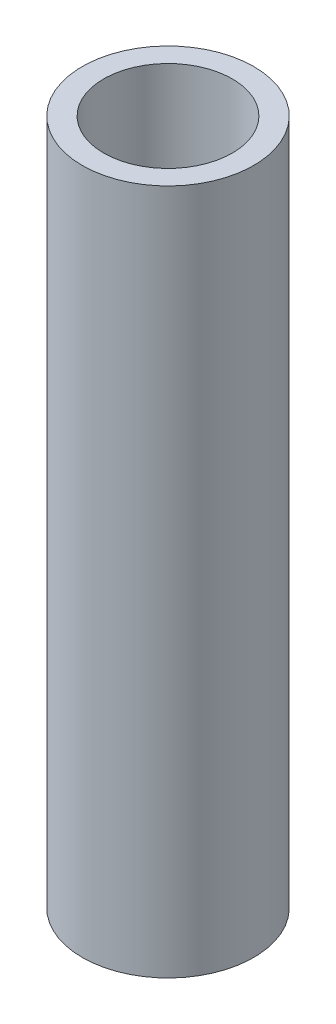
ISO-10303-21;
HEADER;
FILE_DESCRIPTION(('STEP AP214'),'2;1');
FILE_NAME('part.step','',(''),(''),'','','');
FILE_SCHEMA(('AUTOMOTIVE_DESIGN { 1 0 10303 214 1 1 1 1 }'));
ENDSEC;
DATA;
#1=APPLICATION_CONTEXT('core data for automotive mechanical design processes');
#2=APPLICATION_PROTOCOL_DEFINITION('international standard','automotive_design',2000,#1);
#3=PRODUCT_CONTEXT('',#1,'mechanical');
#4=PRODUCT('Part','Part','',(#3));
#5=PRODUCT_RELATED_PRODUCT_CATEGORY('part','',(#4));
#6=PRODUCT_DEFINITION_FORMATION('','',#4);
#7=PRODUCT_DEFINITION_CONTEXT('part definition',#1,'design');
#8=PRODUCT_DEFINITION('design','',#6,#7);
#9=PRODUCT_DEFINITION_SHAPE('','',#8);
#10=(LENGTH_UNIT() NAMED_UNIT(*) SI_UNIT(.MILLI.,.METRE.));
#11=(NAMED_UNIT(*) PLANE_ANGLE_UNIT() SI_UNIT($,.RADIAN.));
#12=(NAMED_UNIT(*) SI_UNIT($,.STERADIAN.) SOLID_ANGLE_UNIT());
#13=UNCERTAINTY_MEASURE_WITH_UNIT(LENGTH_MEASURE(1.E-05),#10,'distance_accuracy_value','');
#14=(GEOMETRIC_REPRESENTATION_CONTEXT(3) GLOBAL_UNCERTAINTY_ASSIGNED_CONTEXT((#13)) GLOBAL_UNIT_ASSIGNED_CONTEXT((#10,
#11,#12)) REPRESENTATION_CONTEXT('',''));
#15=CARTESIAN_POINT('',(0.,0.,0.));
#16=DIRECTION('',(0.,0.,1.));
#17=DIRECTION('',(1.,0.,0.));
#18=AXIS2_PLACEMENT_3D('',#15,#16,#17);
#19=CARTESIAN_POINT('',(0.,8.,0.));
#20=DIRECTION('',(0.,1.,0.));
#21=DIRECTION('',(0.,0.,1.));
#22=AXIS2_PLACEMENT_3D('',#19,#20,#21);
#23=PLANE('',#22);
#24=CARTESIAN_POINT('',(0.,8.,0.));
#25=DIRECTION('',(0.,1.,0.));
#26=DIRECTION('',(0.,0.,1.));
#27=AXIS2_PLACEMENT_3D('',#24,#25,#26);
#28=CIRCLE('',#27,1.);
#29=CARTESIAN_POINT('',(0.,8.,1.));
#30=VERTEX_POINT('',#29);
#31=EDGE_CURVE('E10',#30,#30,#28,.T.);
#32=ORIENTED_EDGE('',*,*,#31,.T.);
#33=EDGE_LOOP('',(#32));
#34=FACE_BOUND('',#33,.T.);
#35=CARTESIAN_POINT('',(0.,8.,0.));
#36=DIRECTION('',(0.,1.,0.));
#37=DIRECTION('',(0.,0.,1.));
#38=AXIS2_PLACEMENT_3D('',#35,#36,#37);
#39=CIRCLE('',#38,0.75);
#40=CARTESIAN_POINT('',(0.,8.,0.75));
#41=VERTEX_POINT('',#40);
#42=EDGE_CURVE('E48',#41,#41,#39,.T.);
#43=ORIENTED_EDGE('',*,*,#42,.F.);
#44=EDGE_LOOP('',(#43));
#45=FACE_BOUND('',#44,.T.);
#46=ADVANCED_FACE('F37',(#34,#45),#23,.T.);
#47=CARTESIAN_POINT('',(0.,0.,0.));
#48=DIRECTION('',(0.,1.,0.));
#49=DIRECTION('',(0.,0.,1.));
#50=AXIS2_PLACEMENT_3D('',#47,#48,#49);
#51=PLANE('',#50);
#52=CARTESIAN_POINT('',(0.,0.,0.));
#53=DIRECTION('',(0.,1.,0.));
#54=DIRECTION('',(0.,0.,1.));
#55=AXIS2_PLACEMENT_3D('',#52,#53,#54);
#56=CIRCLE('',#55,1.);
#57=CARTESIAN_POINT('',(0.,0.,1.));
#58=VERTEX_POINT('',#57);
#59=EDGE_CURVE('E41',#58,#58,#56,.T.);
#60=ORIENTED_EDGE('',*,*,#59,.F.);
#61=EDGE_LOOP('',(#60));
#62=FACE_BOUND('',#61,.T.);
#63=CARTESIAN_POINT('',(0.,0.,0.));
#64=DIRECTION('',(0.,1.,0.));
#65=DIRECTION('',(0.,0.,1.));
#66=AXIS2_PLACEMENT_3D('',#63,#64,#65);
#67=CIRCLE('',#66,0.75);
#68=CARTESIAN_POINT('',(0.,0.,0.75));
#69=VERTEX_POINT('',#68);
#70=EDGE_CURVE('E50',#69,#69,#67,.T.);
#71=ORIENTED_EDGE('',*,*,#70,.T.);
#72=EDGE_LOOP('',(#71));
#73=FACE_BOUND('',#72,.T.);
#74=ADVANCED_FACE('F60',(#62,#73),#51,.F.);
#75=CARTESIAN_POINT('',(0.,8.,0.));
#76=DIRECTION('',(0.,-1.,0.));
#77=DIRECTION('',(0.,0.,-1.));
#78=AXIS2_PLACEMENT_3D('',#75,#76,#77);
#79=CYLINDRICAL_SURFACE('',#78,1.);
#80=ORIENTED_EDGE('',*,*,#31,.F.);
#81=EDGE_LOOP('',(#80));
#82=FACE_BOUND('',#81,.T.);
#83=ORIENTED_EDGE('',*,*,#59,.T.);
#84=EDGE_LOOP('',(#83));
#85=FACE_BOUND('',#84,.T.);
#86=ADVANCED_FACE('F39',(#82,#85),#79,.T.);
#87=CARTESIAN_POINT('',(0.,8.,0.));
#88=DIRECTION('',(0.,-1.,0.));
#89=DIRECTION('',(0.,0.,-1.));
#90=AXIS2_PLACEMENT_3D('',#87,#88,#89);
#91=CYLINDRICAL_SURFACE('',#90,0.75);
#92=ORIENTED_EDGE('',*,*,#42,.T.);
#93=EDGE_LOOP('',(#92));
#94=FACE_BOUND('',#93,.T.);
#95=ORIENTED_EDGE('',*,*,#70,.F.);
#96=EDGE_LOOP('',(#95));
#97=FACE_BOUND('',#96,.T.);
#98=ADVANCED_FACE('F56',(#94,#97),#91,.F.);
#99=CLOSED_SHELL('',(#46,#74,#86,#98));
#100=MANIFOLD_SOLID_BREP('B2',#99);
#101=ADVANCED_BREP_SHAPE_REPRESENTATION('',(#18,#100),#14);
#102=SHAPE_DEFINITION_REPRESENTATION(#9,#101);
ENDSEC;
END-ISO-10303-21;
